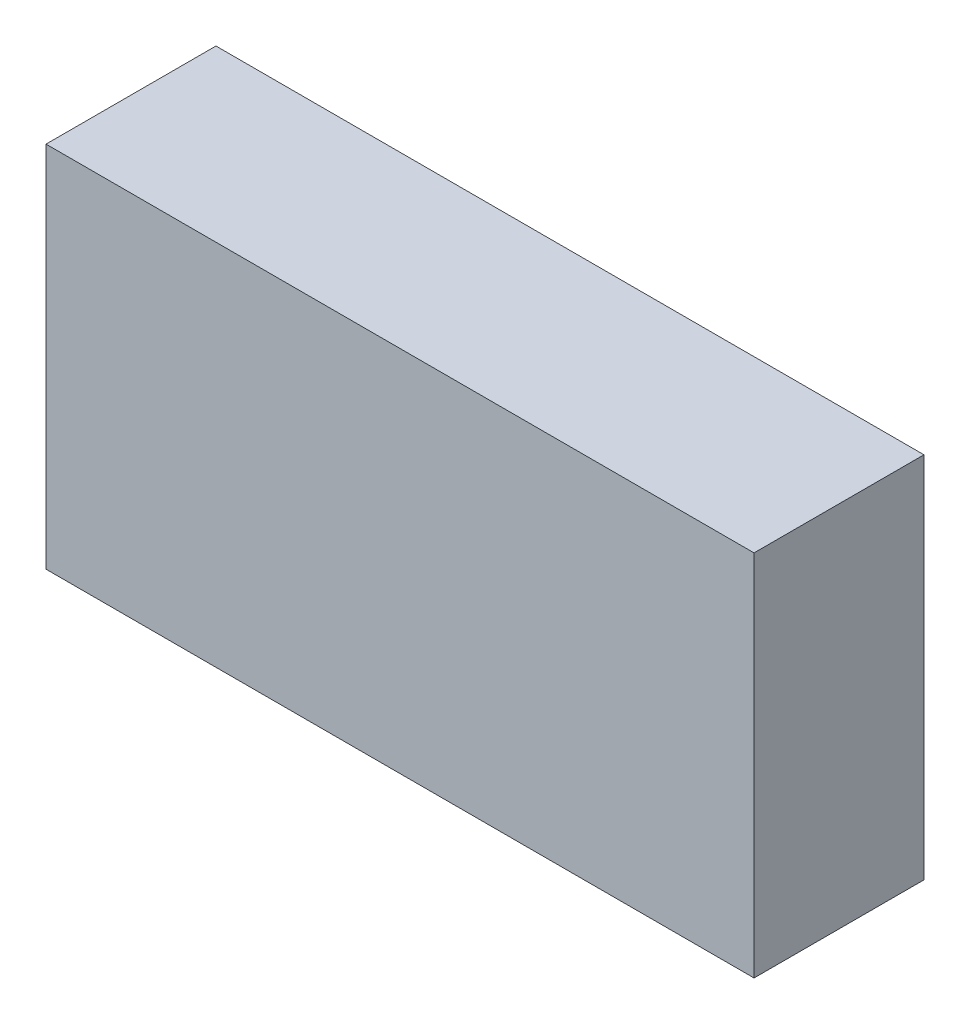
ISO-10303-21;
HEADER;
FILE_DESCRIPTION(('STEP AP214'),'2;1');
FILE_NAME('part.step','',(''),(''),'','','');
FILE_SCHEMA(('AUTOMOTIVE_DESIGN { 1 0 10303 214 1 1 1 1 }'));
ENDSEC;
DATA;
#1=APPLICATION_CONTEXT('core data for automotive mechanical design processes');
#2=APPLICATION_PROTOCOL_DEFINITION('international standard','automotive_design',2000,#1);
#3=PRODUCT_CONTEXT('',#1,'mechanical');
#4=PRODUCT('Part','Part','',(#3));
#5=PRODUCT_RELATED_PRODUCT_CATEGORY('part','',(#4));
#6=PRODUCT_DEFINITION_FORMATION('','',#4);
#7=PRODUCT_DEFINITION_CONTEXT('part definition',#1,'design');
#8=PRODUCT_DEFINITION('design','',#6,#7);
#9=PRODUCT_DEFINITION_SHAPE('','',#8);
#10=(LENGTH_UNIT() NAMED_UNIT(*) SI_UNIT(.MILLI.,.METRE.));
#11=(NAMED_UNIT(*) PLANE_ANGLE_UNIT() SI_UNIT($,.RADIAN.));
#12=(NAMED_UNIT(*) SI_UNIT($,.STERADIAN.) SOLID_ANGLE_UNIT());
#13=UNCERTAINTY_MEASURE_WITH_UNIT(LENGTH_MEASURE(1.E-05),#10,'distance_accuracy_value','');
#14=(GEOMETRIC_REPRESENTATION_CONTEXT(3) GLOBAL_UNCERTAINTY_ASSIGNED_CONTEXT((#13)) GLOBAL_UNIT_ASSIGNED_CONTEXT((#10,
#11,#12)) REPRESENTATION_CONTEXT('',''));
#15=CARTESIAN_POINT('',(0.,0.,0.));
#16=DIRECTION('',(0.,0.,1.));
#17=DIRECTION('',(1.,0.,0.));
#18=AXIS2_PLACEMENT_3D('',#15,#16,#17);
#19=CARTESIAN_POINT('',(0.,0.,0.6));
#20=DIRECTION('',(0.,0.,1.));
#21=DIRECTION('',(1.,0.,0.));
#22=AXIS2_PLACEMENT_3D('',#19,#20,#21);
#23=PLANE('',#22);
#24=DIRECTION('',(1.,0.,0.));
#25=VECTOR('',#24,1.);
#26=CARTESIAN_POINT('',(-1.25,-0.65,0.6));
#27=LINE('',#26,#25);
#28=CARTESIAN_POINT('',(-1.25,-0.65,0.6));
#29=VERTEX_POINT('',#28);
#30=CARTESIAN_POINT('',(1.25,-0.65,0.6));
#31=VERTEX_POINT('',#30);
#32=EDGE_CURVE('E81',#29,#31,#27,.T.);
#33=ORIENTED_EDGE('',*,*,#32,.T.);
#34=DIRECTION('',(0.,1.,0.));
#35=VECTOR('',#34,1.);
#36=CARTESIAN_POINT('',(1.25,-0.65,0.6));
#37=LINE('',#36,#35);
#38=CARTESIAN_POINT('',(1.25,0.65,0.6));
#39=VERTEX_POINT('',#38);
#40=EDGE_CURVE('E70',#31,#39,#37,.T.);
#41=ORIENTED_EDGE('',*,*,#40,.T.);
#42=DIRECTION('',(-1.,0.,0.));
#43=VECTOR('',#42,1.);
#44=CARTESIAN_POINT('',(1.25,0.65,0.6));
#45=LINE('',#44,#43);
#46=CARTESIAN_POINT('',(-1.25,0.65,0.6));
#47=VERTEX_POINT('',#46);
#48=EDGE_CURVE('E20',#39,#47,#45,.T.);
#49=ORIENTED_EDGE('',*,*,#48,.T.);
#50=DIRECTION('',(0.,-1.,0.));
#51=VECTOR('',#50,1.);
#52=CARTESIAN_POINT('',(-1.25,0.65,0.6));
#53=LINE('',#52,#51);
#54=EDGE_CURVE('E11',#47,#29,#53,.T.);
#55=ORIENTED_EDGE('',*,*,#54,.T.);
#56=EDGE_LOOP('',(#33,#41,#49,#55));
#57=FACE_BOUND('',#56,.T.);
#58=ADVANCED_FACE('F16',(#57),#23,.T.);
#59=CARTESIAN_POINT('',(0.,0.,0.));
#60=DIRECTION('',(0.,0.,1.));
#61=DIRECTION('',(1.,0.,0.));
#62=AXIS2_PLACEMENT_3D('',#59,#60,#61);
#63=PLANE('',#62);
#64=DIRECTION('',(1.,0.,0.));
#65=VECTOR('',#64,1.);
#66=CARTESIAN_POINT('',(-1.25,-0.65,0.));
#67=LINE('',#66,#65);
#68=CARTESIAN_POINT('',(-1.25,-0.65,0.));
#69=VERTEX_POINT('',#68);
#70=CARTESIAN_POINT('',(1.25,-0.65,0.));
#71=VERTEX_POINT('',#70);
#72=EDGE_CURVE('E95',#69,#71,#67,.T.);
#73=ORIENTED_EDGE('',*,*,#72,.F.);
#74=DIRECTION('',(0.,-1.,0.));
#75=VECTOR('',#74,1.);
#76=CARTESIAN_POINT('',(-1.25,0.65,0.));
#77=LINE('',#76,#75);
#78=CARTESIAN_POINT('',(-1.25,0.65,0.));
#79=VERTEX_POINT('',#78);
#80=EDGE_CURVE('E26',#79,#69,#77,.T.);
#81=ORIENTED_EDGE('',*,*,#80,.F.);
#82=DIRECTION('',(-1.,0.,0.));
#83=VECTOR('',#82,1.);
#84=CARTESIAN_POINT('',(1.25,0.65,0.));
#85=LINE('',#84,#83);
#86=CARTESIAN_POINT('',(1.25,0.65,0.));
#87=VERTEX_POINT('',#86);
#88=EDGE_CURVE('E59',#87,#79,#85,.T.);
#89=ORIENTED_EDGE('',*,*,#88,.F.);
#90=DIRECTION('',(0.,1.,0.));
#91=VECTOR('',#90,1.);
#92=CARTESIAN_POINT('',(1.25,-0.65,0.));
#93=LINE('',#92,#91);
#94=EDGE_CURVE('E91',#71,#87,#93,.T.);
#95=ORIENTED_EDGE('',*,*,#94,.F.);
#96=EDGE_LOOP('',(#73,#81,#89,#95));
#97=FACE_BOUND('',#96,.T.);
#98=ADVANCED_FACE('F120',(#97),#63,.F.);
#99=CARTESIAN_POINT('',(-1.25,0.65,0.));
#100=DIRECTION('',(1.,0.,0.));
#101=DIRECTION('',(0.,1.,0.));
#102=AXIS2_PLACEMENT_3D('',#99,#100,#101);
#103=PLANE('',#102);
#104=DIRECTION('',(0.,0.,1.));
#105=VECTOR('',#104,1.);
#106=CARTESIAN_POINT('',(-1.25,0.65,0.));
#107=LINE('',#106,#105);
#108=EDGE_CURVE('E109',#79,#47,#107,.T.);
#109=ORIENTED_EDGE('',*,*,#108,.F.);
#110=ORIENTED_EDGE('',*,*,#80,.T.);
#111=DIRECTION('',(0.,0.,1.));
#112=VECTOR('',#111,1.);
#113=CARTESIAN_POINT('',(-1.25,-0.65,0.));
#114=LINE('',#113,#112);
#115=EDGE_CURVE('E88',#69,#29,#114,.T.);
#116=ORIENTED_EDGE('',*,*,#115,.T.);
#117=ORIENTED_EDGE('',*,*,#54,.F.);
#118=EDGE_LOOP('',(#109,#110,#116,#117));
#119=FACE_BOUND('',#118,.T.);
#120=ADVANCED_FACE('F93',(#119),#103,.F.);
#121=CARTESIAN_POINT('',(1.25,0.65,0.));
#122=DIRECTION('',(0.,-1.,0.));
#123=DIRECTION('',(0.,0.,-1.));
#124=AXIS2_PLACEMENT_3D('',#121,#122,#123);
#125=PLANE('',#124);
#126=DIRECTION('',(0.,0.,1.));
#127=VECTOR('',#126,1.);
#128=CARTESIAN_POINT('',(1.25,0.65,0.));
#129=LINE('',#128,#127);
#130=EDGE_CURVE('E104',#87,#39,#129,.T.);
#131=ORIENTED_EDGE('',*,*,#130,.F.);
#132=ORIENTED_EDGE('',*,*,#88,.T.);
#133=ORIENTED_EDGE('',*,*,#108,.T.);
#134=ORIENTED_EDGE('',*,*,#48,.F.);
#135=EDGE_LOOP('',(#131,#132,#133,#134));
#136=FACE_BOUND('',#135,.T.);
#137=ADVANCED_FACE('F18',(#136),#125,.F.);
#138=CARTESIAN_POINT('',(1.25,-0.65,0.));
#139=DIRECTION('',(-1.,0.,0.));
#140=DIRECTION('',(0.,0.,1.));
#141=AXIS2_PLACEMENT_3D('',#138,#139,#140);
#142=PLANE('',#141);
#143=DIRECTION('',(0.,0.,1.));
#144=VECTOR('',#143,1.);
#145=CARTESIAN_POINT('',(1.25,-0.65,0.));
#146=LINE('',#145,#144);
#147=EDGE_CURVE('E89',#71,#31,#146,.T.);
#148=ORIENTED_EDGE('',*,*,#147,.F.);
#149=ORIENTED_EDGE('',*,*,#94,.T.);
#150=ORIENTED_EDGE('',*,*,#130,.T.);
#151=ORIENTED_EDGE('',*,*,#40,.F.);
#152=EDGE_LOOP('',(#148,#149,#150,#151));
#153=FACE_BOUND('',#152,.T.);
#154=ADVANCED_FACE('F119',(#153),#142,.F.);
#155=CARTESIAN_POINT('',(-1.25,-0.65,0.));
#156=DIRECTION('',(0.,1.,0.));
#157=DIRECTION('',(1.,0.,0.));
#158=AXIS2_PLACEMENT_3D('',#155,#156,#157);
#159=PLANE('',#158);
#160=ORIENTED_EDGE('',*,*,#115,.F.);
#161=ORIENTED_EDGE('',*,*,#72,.T.);
#162=ORIENTED_EDGE('',*,*,#147,.T.);
#163=ORIENTED_EDGE('',*,*,#32,.F.);
#164=EDGE_LOOP('',(#160,#161,#162,#163));
#165=FACE_BOUND('',#164,.T.);
#166=ADVANCED_FACE('F86',(#165),#159,.F.);
#167=CLOSED_SHELL('',(#58,#98,#120,#137,#154,#166));
#168=MANIFOLD_SOLID_BREP('B1',#167);
#169=ADVANCED_BREP_SHAPE_REPRESENTATION('',(#18,#168),#14);
#170=SHAPE_DEFINITION_REPRESENTATION(#9,#169);
ENDSEC;
END-ISO-10303-21;
